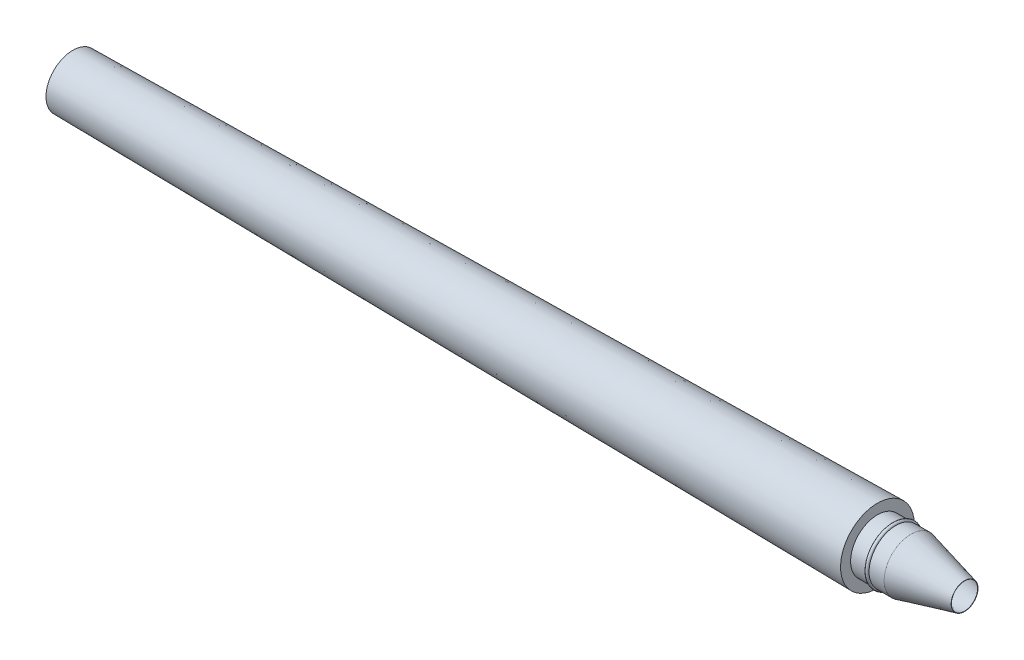
ISO-10303-21;
HEADER;
FILE_DESCRIPTION(('STEP AP214'),'2;1');
FILE_NAME('part.step','',(''),(''),'','','');
FILE_SCHEMA(('AUTOMOTIVE_DESIGN { 1 0 10303 214 1 1 1 1 }'));
ENDSEC;
DATA;
#1=APPLICATION_CONTEXT('core data for automotive mechanical design processes');
#2=APPLICATION_PROTOCOL_DEFINITION('international standard','automotive_design',2000,#1);
#3=PRODUCT_CONTEXT('',#1,'mechanical');
#4=PRODUCT('Part','Part','',(#3));
#5=PRODUCT_RELATED_PRODUCT_CATEGORY('part','',(#4));
#6=PRODUCT_DEFINITION_FORMATION('','',#4);
#7=PRODUCT_DEFINITION_CONTEXT('part definition',#1,'design');
#8=PRODUCT_DEFINITION('design','',#6,#7);
#9=PRODUCT_DEFINITION_SHAPE('','',#8);
#10=(LENGTH_UNIT() NAMED_UNIT(*) SI_UNIT(.MILLI.,.METRE.));
#11=(NAMED_UNIT(*) PLANE_ANGLE_UNIT() SI_UNIT($,.RADIAN.));
#12=(NAMED_UNIT(*) SI_UNIT($,.STERADIAN.) SOLID_ANGLE_UNIT());
#13=UNCERTAINTY_MEASURE_WITH_UNIT(LENGTH_MEASURE(1.E-05),#10,'distance_accuracy_value','');
#14=(GEOMETRIC_REPRESENTATION_CONTEXT(3) GLOBAL_UNCERTAINTY_ASSIGNED_CONTEXT((#13)) GLOBAL_UNIT_ASSIGNED_CONTEXT((#10,
#11,#12)) REPRESENTATION_CONTEXT('',''));
#15=CARTESIAN_POINT('',(0.,0.,0.));
#16=DIRECTION('',(0.,0.,1.));
#17=DIRECTION('',(1.,0.,0.));
#18=AXIS2_PLACEMENT_3D('',#15,#16,#17);
#19=CARTESIAN_POINT('',(58.4938447187191,0.,0.));
#20=DIRECTION('',(-1.,0.,0.));
#21=DIRECTION('',(0.,-1.,0.));
#22=AXIS2_PLACEMENT_3D('',#19,#20,#21);
#23=CONICAL_SURFACE('',#22,3.94999999999998,0.244978663126862);
#24=CARTESIAN_POINT('',(66.4878732187482,0.,0.));
#25=DIRECTION('',(-1.,0.,0.));
#26=DIRECTION('',(0.,-1.,0.));
#27=AXIS2_PLACEMENT_3D('',#24,#25,#26);
#28=CIRCLE('',#27,1.95149287499273);
#29=CARTESIAN_POINT('',(66.4878732187482,-1.95149287499271,0.));
#30=VERTEX_POINT('',#29);
#31=EDGE_CURVE('E83',#30,#30,#28,.T.);
#32=ORIENTED_EDGE('',*,*,#31,.F.);
#33=EDGE_LOOP('',(#32));
#34=FACE_BOUND('',#33,.T.);
#35=CARTESIAN_POINT('',(58.4938447187191,0.,0.));
#36=DIRECTION('',(-1.,0.,0.));
#37=DIRECTION('',(0.,-1.,0.));
#38=AXIS2_PLACEMENT_3D('',#35,#36,#37);
#39=CIRCLE('',#38,3.94999999999998);
#40=CARTESIAN_POINT('',(58.4938447187191,-3.94999999999996,0.));
#41=VERTEX_POINT('',#40);
#42=EDGE_CURVE('E10',#41,#41,#39,.T.);
#43=ORIENTED_EDGE('',*,*,#42,.T.);
#44=EDGE_LOOP('',(#43));
#45=FACE_BOUND('',#44,.T.);
#46=ADVANCED_FACE('F39',(#34,#45),#23,.F.);
#47=CARTESIAN_POINT('',(-66.5,0.,0.));
#48=DIRECTION('',(-1.,0.,0.));
#49=DIRECTION('',(0.,-1.,0.));
#50=AXIS2_PLACEMENT_3D('',#47,#48,#49);
#51=CYLINDRICAL_SURFACE('',#50,3.94999999999998);
#52=ORIENTED_EDGE('',*,*,#42,.F.);
#53=EDGE_LOOP('',(#52));
#54=FACE_BOUND('',#53,.T.);
#55=CARTESIAN_POINT('',(56.1936491673104,0.,0.));
#56=DIRECTION('',(-1.,0.,0.));
#57=DIRECTION('',(0.,-1.,0.));
#58=AXIS2_PLACEMENT_3D('',#55,#56,#57);
#59=CIRCLE('',#58,3.94999999999998);
#60=CARTESIAN_POINT('',(56.1936491673104,-3.94999999999996,0.));
#61=VERTEX_POINT('',#60);
#62=EDGE_CURVE('E44',#61,#61,#59,.T.);
#63=ORIENTED_EDGE('',*,*,#62,.T.);
#64=EDGE_LOOP('',(#63));
#65=FACE_BOUND('',#64,.T.);
#66=ADVANCED_FACE('F91',(#54,#65),#51,.F.);
#67=CARTESIAN_POINT('',(56.,0.,0.));
#68=DIRECTION('',(-1.,0.,0.));
#69=DIRECTION('',(0.,-1.,0.));
#70=AXIS2_PLACEMENT_3D('',#67,#68,#69);
#71=TOROIDAL_SURFACE('',#70,3.99999999999998,0.2);
#72=ORIENTED_EDGE('',*,*,#62,.F.);
#73=EDGE_LOOP('',(#72));
#74=FACE_BOUND('',#73,.T.);
#75=CARTESIAN_POINT('',(55.8063508326896,0.,0.));
#76=DIRECTION('',(-1.,0.,0.));
#77=DIRECTION('',(0.,-1.,0.));
#78=AXIS2_PLACEMENT_3D('',#75,#76,#77);
#79=CIRCLE('',#78,3.94999999999998);
#80=CARTESIAN_POINT('',(55.8063508326896,-3.94999999999996,0.));
#81=VERTEX_POINT('',#80);
#82=EDGE_CURVE('E47',#81,#81,#79,.T.);
#83=ORIENTED_EDGE('',*,*,#82,.T.);
#84=EDGE_LOOP('',(#83));
#85=FACE_BOUND('',#84,.T.);
#86=ADVANCED_FACE('F100',(#74,#85),#71,.F.);
#87=CARTESIAN_POINT('',(-66.5,0.,0.));
#88=DIRECTION('',(-1.,0.,0.));
#89=DIRECTION('',(0.,-1.,0.));
#90=AXIS2_PLACEMENT_3D('',#87,#88,#89);
#91=CYLINDRICAL_SURFACE('',#90,3.94999999999998);
#92=ORIENTED_EDGE('',*,*,#82,.F.);
#93=EDGE_LOOP('',(#92));
#94=FACE_BOUND('',#93,.T.);
#95=CARTESIAN_POINT('',(53.45,0.,0.));
#96=DIRECTION('',(-1.,0.,0.));
#97=DIRECTION('',(0.,-1.,0.));
#98=AXIS2_PLACEMENT_3D('',#95,#96,#97);
#99=CIRCLE('',#98,3.94999999999998);
#100=CARTESIAN_POINT('',(53.45,-3.94999999999996,0.));
#101=VERTEX_POINT('',#100);
#102=EDGE_CURVE('E52',#101,#101,#99,.T.);
#103=ORIENTED_EDGE('',*,*,#102,.T.);
#104=EDGE_LOOP('',(#103));
#105=FACE_BOUND('',#104,.T.);
#106=ADVANCED_FACE('F105',(#94,#105),#91,.F.);
#107=CARTESIAN_POINT('',(53.45,5.5,0.));
#108=DIRECTION('',(1.,0.,0.));
#109=DIRECTION('',(0.,1.,0.));
#110=AXIS2_PLACEMENT_3D('',#107,#108,#109);
#111=PLANE('',#110);
#112=ORIENTED_EDGE('',*,*,#102,.F.);
#113=EDGE_LOOP('',(#112));
#114=FACE_BOUND('',#113,.T.);
#115=CARTESIAN_POINT('',(53.45,0.,0.));
#116=DIRECTION('',(-1.,0.,0.));
#117=DIRECTION('',(0.,-1.,0.));
#118=AXIS2_PLACEMENT_3D('',#115,#116,#117);
#119=CIRCLE('',#118,5.44937109390255);
#120=CARTESIAN_POINT('',(53.45,-5.44937109390253,0.));
#121=VERTEX_POINT('',#120);
#122=EDGE_CURVE('E59',#121,#121,#119,.T.);
#123=ORIENTED_EDGE('',*,*,#122,.T.);
#124=EDGE_LOOP('',(#123));
#125=FACE_BOUND('',#124,.T.);
#126=ADVANCED_FACE('F107',(#114,#125),#111,.F.);
#127=CARTESIAN_POINT('',(-66.45,0.,0.));
#128=DIRECTION('',(1.,0.,0.));
#129=DIRECTION('',(0.,1.,0.));
#130=AXIS2_PLACEMENT_3D('',#127,#128,#129);
#131=CONICAL_SURFACE('',#130,3.95062109390258,0.0124993490193615);
#132=ORIENTED_EDGE('',*,*,#122,.F.);
#133=EDGE_LOOP('',(#132));
#134=FACE_BOUND('',#133,.T.);
#135=CARTESIAN_POINT('',(-66.45,0.,0.));
#136=DIRECTION('',(-1.,0.,0.));
#137=DIRECTION('',(0.,-1.,0.));
#138=AXIS2_PLACEMENT_3D('',#135,#136,#137);
#139=CIRCLE('',#138,3.95062109390258);
#140=CARTESIAN_POINT('',(-66.45,-3.95062109390258,0.));
#141=VERTEX_POINT('',#140);
#142=EDGE_CURVE('E63',#141,#141,#139,.T.);
#143=ORIENTED_EDGE('',*,*,#142,.T.);
#144=EDGE_LOOP('',(#143));
#145=FACE_BOUND('',#144,.T.);
#146=ADVANCED_FACE('F115',(#134,#145),#131,.F.);
#147=CARTESIAN_POINT('',(-66.45,0.,0.));
#148=DIRECTION('',(-1.,0.,0.));
#149=DIRECTION('',(0.,-1.,0.));
#150=AXIS2_PLACEMENT_3D('',#147,#148,#149);
#151=PLANE('',#150);
#152=ORIENTED_EDGE('',*,*,#142,.F.);
#153=EDGE_LOOP('',(#152));
#154=FACE_BOUND('',#153,.T.);
#155=ADVANCED_FACE('F118',(#154),#151,.F.);
#156=CARTESIAN_POINT('',(-66.5,0.,0.));
#157=DIRECTION('',(-1.,0.,0.));
#158=DIRECTION('',(0.,-1.,0.));
#159=AXIS2_PLACEMENT_3D('',#156,#157,#158);
#160=PLANE('',#159);
#161=CARTESIAN_POINT('',(-66.5,0.,0.));
#162=DIRECTION('',(-1.,0.,0.));
#163=DIRECTION('',(0.,-1.,0.));
#164=AXIS2_PLACEMENT_3D('',#161,#162,#163);
#165=CIRCLE('',#164,4.);
#166=CARTESIAN_POINT('',(-66.5,-4.,0.));
#167=VERTEX_POINT('',#166);
#168=EDGE_CURVE('E65',#167,#167,#165,.T.);
#169=ORIENTED_EDGE('',*,*,#168,.T.);
#170=EDGE_LOOP('',(#169));
#171=FACE_BOUND('',#170,.T.);
#172=ADVANCED_FACE('F116',(#171),#160,.T.);
#173=CARTESIAN_POINT('',(-66.5,0.,0.));
#174=DIRECTION('',(1.,0.,0.));
#175=DIRECTION('',(0.,1.,0.));
#176=AXIS2_PLACEMENT_3D('',#173,#174,#175);
#177=CONICAL_SURFACE('',#176,4.,0.0124993490193615);
#178=CARTESIAN_POINT('',(53.5,0.,0.));
#179=DIRECTION('',(-1.,0.,0.));
#180=DIRECTION('',(0.,-1.,0.));
#181=AXIS2_PLACEMENT_3D('',#178,#179,#180);
#182=CIRCLE('',#181,5.49999999999998);
#183=CARTESIAN_POINT('',(53.5,-5.49999999999996,0.));
#184=VERTEX_POINT('',#183);
#185=EDGE_CURVE('E70',#184,#184,#182,.T.);
#186=ORIENTED_EDGE('',*,*,#185,.T.);
#187=EDGE_LOOP('',(#186));
#188=FACE_BOUND('',#187,.T.);
#189=ORIENTED_EDGE('',*,*,#168,.F.);
#190=EDGE_LOOP('',(#189));
#191=FACE_BOUND('',#190,.T.);
#192=ADVANCED_FACE('F121',(#188,#191),#177,.T.);
#193=CARTESIAN_POINT('',(53.5,5.5,0.));
#194=DIRECTION('',(1.,0.,0.));
#195=DIRECTION('',(0.,1.,0.));
#196=AXIS2_PLACEMENT_3D('',#193,#194,#195);
#197=PLANE('',#196);
#198=CARTESIAN_POINT('',(53.5,0.,0.));
#199=DIRECTION('',(-1.,0.,0.));
#200=DIRECTION('',(0.,-1.,0.));
#201=AXIS2_PLACEMENT_3D('',#198,#199,#200);
#202=CIRCLE('',#201,3.99999999999998);
#203=CARTESIAN_POINT('',(53.5,-3.99999999999996,0.));
#204=VERTEX_POINT('',#203);
#205=EDGE_CURVE('E68',#204,#204,#202,.T.);
#206=ORIENTED_EDGE('',*,*,#205,.T.);
#207=EDGE_LOOP('',(#206));
#208=FACE_BOUND('',#207,.T.);
#209=ORIENTED_EDGE('',*,*,#185,.F.);
#210=EDGE_LOOP('',(#209));
#211=FACE_BOUND('',#210,.T.);
#212=ADVANCED_FACE('F126',(#208,#211),#197,.T.);
#213=CARTESIAN_POINT('',(-66.5,0.,0.));
#214=DIRECTION('',(-1.,0.,0.));
#215=DIRECTION('',(0.,-1.,0.));
#216=AXIS2_PLACEMENT_3D('',#213,#214,#215);
#217=CYLINDRICAL_SURFACE('',#216,3.99999999999998);
#218=CARTESIAN_POINT('',(55.75,0.,0.));
#219=DIRECTION('',(-1.,0.,0.));
#220=DIRECTION('',(0.,-1.,0.));
#221=AXIS2_PLACEMENT_3D('',#218,#219,#220);
#222=CIRCLE('',#221,3.99999999999998);
#223=CARTESIAN_POINT('',(55.75,-3.99999999999996,0.));
#224=VERTEX_POINT('',#223);
#225=EDGE_CURVE('E71',#224,#224,#222,.T.);
#226=ORIENTED_EDGE('',*,*,#225,.T.);
#227=EDGE_LOOP('',(#226));
#228=FACE_BOUND('',#227,.T.);
#229=ORIENTED_EDGE('',*,*,#205,.F.);
#230=EDGE_LOOP('',(#229));
#231=FACE_BOUND('',#230,.T.);
#232=ADVANCED_FACE('F134',(#228,#231),#217,.T.);
#233=CARTESIAN_POINT('',(56.,0.,0.));
#234=DIRECTION('',(-1.,0.,0.));
#235=DIRECTION('',(0.,-1.,0.));
#236=AXIS2_PLACEMENT_3D('',#233,#234,#235);
#237=TOROIDAL_SURFACE('',#236,3.99999999999998,0.25);
#238=CARTESIAN_POINT('',(56.25,0.,0.));
#239=DIRECTION('',(-1.,0.,0.));
#240=DIRECTION('',(0.,-1.,0.));
#241=AXIS2_PLACEMENT_3D('',#238,#239,#240);
#242=CIRCLE('',#241,3.99999999999998);
#243=CARTESIAN_POINT('',(56.25,-3.99999999999996,0.));
#244=VERTEX_POINT('',#243);
#245=EDGE_CURVE('E78',#244,#244,#242,.T.);
#246=ORIENTED_EDGE('',*,*,#245,.T.);
#247=EDGE_LOOP('',(#246));
#248=FACE_BOUND('',#247,.T.);
#249=ORIENTED_EDGE('',*,*,#225,.F.);
#250=EDGE_LOOP('',(#249));
#251=FACE_BOUND('',#250,.T.);
#252=ADVANCED_FACE('F137',(#248,#251),#237,.T.);
#253=CARTESIAN_POINT('',(-66.5,0.,0.));
#254=DIRECTION('',(-1.,0.,0.));
#255=DIRECTION('',(0.,-1.,0.));
#256=AXIS2_PLACEMENT_3D('',#253,#254,#255);
#257=CYLINDRICAL_SURFACE('',#256,3.99999999999998);
#258=CARTESIAN_POINT('',(58.5,0.,0.));
#259=DIRECTION('',(-1.,0.,0.));
#260=DIRECTION('',(0.,-1.,0.));
#261=AXIS2_PLACEMENT_3D('',#258,#259,#260);
#262=CIRCLE('',#261,3.99999999999998);
#263=CARTESIAN_POINT('',(58.5,-3.99999999999996,0.));
#264=VERTEX_POINT('',#263);
#265=EDGE_CURVE('E80',#264,#264,#262,.T.);
#266=ORIENTED_EDGE('',*,*,#265,.T.);
#267=EDGE_LOOP('',(#266));
#268=FACE_BOUND('',#267,.T.);
#269=ORIENTED_EDGE('',*,*,#245,.F.);
#270=EDGE_LOOP('',(#269));
#271=FACE_BOUND('',#270,.T.);
#272=ADVANCED_FACE('F138',(#268,#271),#257,.T.);
#273=CARTESIAN_POINT('',(58.5,0.,0.));
#274=DIRECTION('',(-1.,0.,0.));
#275=DIRECTION('',(0.,-1.,0.));
#276=AXIS2_PLACEMENT_3D('',#273,#274,#275);
#277=CONICAL_SURFACE('',#276,3.99999999999998,0.244978663126861);
#278=CARTESIAN_POINT('',(66.5,0.,0.));
#279=DIRECTION('',(-1.,0.,0.));
#280=DIRECTION('',(0.,-1.,0.));
#281=AXIS2_PLACEMENT_3D('',#278,#279,#280);
#282=CIRCLE('',#281,2.);
#283=CARTESIAN_POINT('',(66.5,-1.99999999999998,0.));
#284=VERTEX_POINT('',#283);
#285=EDGE_CURVE('E85',#284,#284,#282,.T.);
#286=ORIENTED_EDGE('',*,*,#285,.T.);
#287=EDGE_LOOP('',(#286));
#288=FACE_BOUND('',#287,.T.);
#289=ORIENTED_EDGE('',*,*,#265,.F.);
#290=EDGE_LOOP('',(#289));
#291=FACE_BOUND('',#290,.T.);
#292=ADVANCED_FACE('F145',(#288,#291),#277,.T.);
#293=CARTESIAN_POINT('',(66.5,0.,0.));
#294=DIRECTION('',(1.,0.,0.));
#295=DIRECTION('',(0.,1.,0.));
#296=AXIS2_PLACEMENT_3D('',#293,#294,#295);
#297=CONICAL_SURFACE('',#296,2.,1.32581766366808);
#298=ORIENTED_EDGE('',*,*,#31,.T.);
#299=EDGE_LOOP('',(#298));
#300=FACE_BOUND('',#299,.T.);
#301=ORIENTED_EDGE('',*,*,#285,.F.);
#302=EDGE_LOOP('',(#301));
#303=FACE_BOUND('',#302,.T.);
#304=ADVANCED_FACE('F90',(#300,#303),#297,.F.);
#305=CLOSED_SHELL('',(#46,#66,#86,#106,#126,#146,#155,#172,#192,#212,#232,#252,#272,#292,#304));
#306=MANIFOLD_SOLID_BREP('B2',#305);
#307=ADVANCED_BREP_SHAPE_REPRESENTATION('',(#18,#306),#14);
#308=SHAPE_DEFINITION_REPRESENTATION(#9,#307);
ENDSEC;
END-ISO-10303-21;
